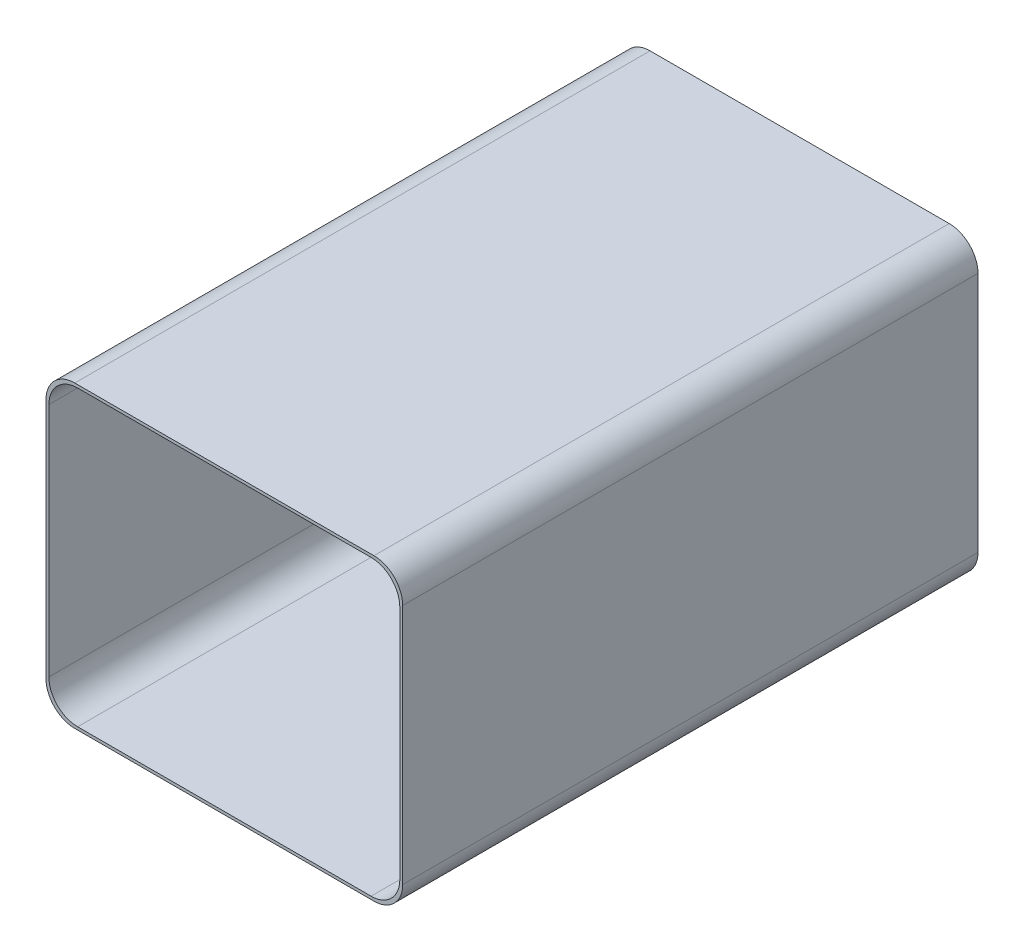
ISO-10303-21;
HEADER;
FILE_DESCRIPTION(('STEP AP214'),'2;1');
FILE_NAME('part.step','',(''),(''),'','','');
FILE_SCHEMA(('AUTOMOTIVE_DESIGN { 1 0 10303 214 1 1 1 1 }'));
ENDSEC;
DATA;
#1=APPLICATION_CONTEXT('core data for automotive mechanical design processes');
#2=APPLICATION_PROTOCOL_DEFINITION('international standard','automotive_design',2000,#1);
#3=PRODUCT_CONTEXT('',#1,'mechanical');
#4=PRODUCT('Part','Part','',(#3));
#5=PRODUCT_RELATED_PRODUCT_CATEGORY('part','',(#4));
#6=PRODUCT_DEFINITION_FORMATION('','',#4);
#7=PRODUCT_DEFINITION_CONTEXT('part definition',#1,'design');
#8=PRODUCT_DEFINITION('design','',#6,#7);
#9=PRODUCT_DEFINITION_SHAPE('','',#8);
#10=(LENGTH_UNIT() NAMED_UNIT(*) SI_UNIT(.MILLI.,.METRE.));
#11=(NAMED_UNIT(*) PLANE_ANGLE_UNIT() SI_UNIT($,.RADIAN.));
#12=(NAMED_UNIT(*) SI_UNIT($,.STERADIAN.) SOLID_ANGLE_UNIT());
#13=UNCERTAINTY_MEASURE_WITH_UNIT(LENGTH_MEASURE(1.E-05),#10,'distance_accuracy_value','');
#14=(GEOMETRIC_REPRESENTATION_CONTEXT(3) GLOBAL_UNCERTAINTY_ASSIGNED_CONTEXT((#13)) GLOBAL_UNIT_ASSIGNED_CONTEXT((#10,
#11,#12)) REPRESENTATION_CONTEXT('',''));
#15=CARTESIAN_POINT('',(0.,0.,0.));
#16=DIRECTION('',(0.,0.,1.));
#17=DIRECTION('',(1.,0.,0.));
#18=AXIS2_PLACEMENT_3D('',#15,#16,#17);
#19=CARTESIAN_POINT('',(540.837944664032,-394.765480895916,1000.));
#20=DIRECTION('',(0.,0.,1.));
#21=DIRECTION('',(1.,0.,0.));
#22=AXIS2_PLACEMENT_3D('',#19,#20,#21);
#23=PLANE('',#22);
#24=CARTESIAN_POINT('',(540.837944664032,-394.765480895916,1000.));
#25=DIRECTION('',(0.,0.,1.));
#26=DIRECTION('',(1.,0.,0.));
#27=AXIS2_PLACEMENT_3D('',#24,#25,#26);
#28=CIRCLE('',#27,50.);
#29=CARTESIAN_POINT('',(540.837944664031,-444.765480895916,1000.));
#30=VERTEX_POINT('',#29);
#31=CARTESIAN_POINT('',(590.837944664032,-394.765480895915,1000.));
#32=VERTEX_POINT('',#31);
#33=EDGE_CURVE('E246',#30,#32,#28,.T.);
#34=ORIENTED_EDGE('',*,*,#33,.T.);
#35=DIRECTION('',(0.,1.,0.));
#36=VECTOR('',#35,1.);
#37=CARTESIAN_POINT('',(590.837944664032,25.234519104084,1000.));
#38=LINE('',#37,#36);
#39=CARTESIAN_POINT('',(590.837944664032,25.234519104084,1000.));
#40=VERTEX_POINT('',#39);
#41=EDGE_CURVE('E250',#32,#40,#38,.T.);
#42=ORIENTED_EDGE('',*,*,#41,.T.);
#43=CARTESIAN_POINT('',(540.837944664032,25.2345191040843,1000.));
#44=DIRECTION('',(0.,0.,1.));
#45=DIRECTION('',(-1.,0.,0.));
#46=AXIS2_PLACEMENT_3D('',#43,#44,#45);
#47=CIRCLE('',#46,50.);
#48=CARTESIAN_POINT('',(540.837944664031,75.2345191040843,1000.));
#49=VERTEX_POINT('',#48);
#50=EDGE_CURVE('E254',#40,#49,#47,.T.);
#51=ORIENTED_EDGE('',*,*,#50,.T.);
#52=DIRECTION('',(-1.,0.,0.));
#53=VECTOR('',#52,1.);
#54=CARTESIAN_POINT('',(20.837944664032,75.2345191040843,1000.));
#55=LINE('',#54,#53);
#56=CARTESIAN_POINT('',(20.837944664032,75.2345191040843,1000.));
#57=VERTEX_POINT('',#56);
#58=EDGE_CURVE('E257',#49,#57,#55,.T.);
#59=ORIENTED_EDGE('',*,*,#58,.T.);
#60=CARTESIAN_POINT('',(20.8379446640316,25.2345191040843,1000.));
#61=DIRECTION('',(0.,0.,1.));
#62=DIRECTION('',(1.,0.,0.));
#63=AXIS2_PLACEMENT_3D('',#60,#61,#62);
#64=CIRCLE('',#63,50.);
#65=CARTESIAN_POINT('',(-29.1620553359684,25.234519104084,1000.));
#66=VERTEX_POINT('',#65);
#67=EDGE_CURVE('E260',#57,#66,#64,.T.);
#68=ORIENTED_EDGE('',*,*,#67,.T.);
#69=DIRECTION('',(0.,-1.,0.));
#70=VECTOR('',#69,1.);
#71=CARTESIAN_POINT('',(-29.1620553359684,25.234519104084,1000.));
#72=LINE('',#71,#70);
#73=CARTESIAN_POINT('',(-29.1620553359683,-394.765480895915,1000.));
#74=VERTEX_POINT('',#73);
#75=EDGE_CURVE('E263',#66,#74,#72,.T.);
#76=ORIENTED_EDGE('',*,*,#75,.T.);
#77=CARTESIAN_POINT('',(20.8379446640317,-394.765480895916,1000.));
#78=DIRECTION('',(0.,0.,1.));
#79=DIRECTION('',(1.,0.,0.));
#80=AXIS2_PLACEMENT_3D('',#77,#78,#79);
#81=CIRCLE('',#80,50.);
#82=CARTESIAN_POINT('',(20.837944664032,-444.765480895916,1000.));
#83=VERTEX_POINT('',#82);
#84=EDGE_CURVE('E266',#74,#83,#81,.T.);
#85=ORIENTED_EDGE('',*,*,#84,.T.);
#86=DIRECTION('',(1.,0.,0.));
#87=VECTOR('',#86,1.);
#88=CARTESIAN_POINT('',(20.837944664032,-444.765480895916,1000.));
#89=LINE('',#88,#87);
#90=EDGE_CURVE('E269',#83,#30,#89,.T.);
#91=ORIENTED_EDGE('',*,*,#90,.T.);
#92=EDGE_LOOP('',(#34,#42,#51,#59,#68,#76,#85,#91));
#93=FACE_BOUND('',#92,.T.);
#94=DIRECTION('',(0.,1.,0.));
#95=VECTOR('',#94,1.);
#96=CARTESIAN_POINT('',(585.837944664032,20.234519104084,1000.));
#97=LINE('',#96,#95);
#98=CARTESIAN_POINT('',(585.837944664032,-389.765480895915,1000.));
#99=VERTEX_POINT('',#98);
#100=CARTESIAN_POINT('',(585.837944664032,20.234519104084,1000.));
#101=VERTEX_POINT('',#100);
#102=EDGE_CURVE('E166',#99,#101,#97,.T.);
#103=ORIENTED_EDGE('',*,*,#102,.F.);
#104=CARTESIAN_POINT('',(535.837944664032,-389.765480895916,1000.));
#105=DIRECTION('',(0.,0.,1.));
#106=DIRECTION('',(1.,0.,0.));
#107=AXIS2_PLACEMENT_3D('',#104,#105,#106);
#108=CIRCLE('',#107,50.);
#109=CARTESIAN_POINT('',(535.837944664031,-439.765480895916,1000.));
#110=VERTEX_POINT('',#109);
#111=EDGE_CURVE('E157',#110,#99,#108,.T.);
#112=ORIENTED_EDGE('',*,*,#111,.F.);
#113=DIRECTION('',(1.,0.,0.));
#114=VECTOR('',#113,1.);
#115=CARTESIAN_POINT('',(25.837944664032,-439.765480895916,1000.));
#116=LINE('',#115,#114);
#117=CARTESIAN_POINT('',(25.8379446640321,-439.765480895916,1000.));
#118=VERTEX_POINT('',#117);
#119=EDGE_CURVE('E198',#118,#110,#116,.T.);
#120=ORIENTED_EDGE('',*,*,#119,.F.);
#121=CARTESIAN_POINT('',(25.8379446640317,-389.765480895916,1000.));
#122=DIRECTION('',(0.,0.,1.));
#123=DIRECTION('',(1.,0.,0.));
#124=AXIS2_PLACEMENT_3D('',#121,#122,#123);
#125=CIRCLE('',#124,50.);
#126=CARTESIAN_POINT('',(-24.1620553359683,-389.765480895915,1000.));
#127=VERTEX_POINT('',#126);
#128=EDGE_CURVE('E195',#127,#118,#125,.T.);
#129=ORIENTED_EDGE('',*,*,#128,.F.);
#130=DIRECTION('',(0.,-1.,0.));
#131=VECTOR('',#130,1.);
#132=CARTESIAN_POINT('',(-24.1620553359684,20.234519104084,1000.));
#133=LINE('',#132,#131);
#134=CARTESIAN_POINT('',(-24.1620553359684,20.234519104084,1000.));
#135=VERTEX_POINT('',#134);
#136=EDGE_CURVE('E192',#135,#127,#133,.T.);
#137=ORIENTED_EDGE('',*,*,#136,.F.);
#138=CARTESIAN_POINT('',(25.8379446640316,20.2345191040843,1000.));
#139=DIRECTION('',(0.,0.,1.));
#140=DIRECTION('',(1.,0.,0.));
#141=AXIS2_PLACEMENT_3D('',#138,#139,#140);
#142=CIRCLE('',#141,50.);
#143=CARTESIAN_POINT('',(25.837944664032,70.2345191040843,1000.));
#144=VERTEX_POINT('',#143);
#145=EDGE_CURVE('E189',#144,#135,#142,.T.);
#146=ORIENTED_EDGE('',*,*,#145,.F.);
#147=DIRECTION('',(-1.,0.,0.));
#148=VECTOR('',#147,1.);
#149=CARTESIAN_POINT('',(25.837944664032,70.2345191040843,1000.));
#150=LINE('',#149,#148);
#151=CARTESIAN_POINT('',(535.837944664031,70.2345191040843,1000.));
#152=VERTEX_POINT('',#151);
#153=EDGE_CURVE('E184',#152,#144,#150,.T.);
#154=ORIENTED_EDGE('',*,*,#153,.F.);
#155=CARTESIAN_POINT('',(535.837944664032,20.2345191040843,1000.));
#156=DIRECTION('',(0.,0.,1.));
#157=DIRECTION('',(-1.,0.,0.));
#158=AXIS2_PLACEMENT_3D('',#155,#156,#157);
#159=CIRCLE('',#158,50.);
#160=EDGE_CURVE('E180',#101,#152,#159,.T.);
#161=ORIENTED_EDGE('',*,*,#160,.F.);
#162=EDGE_LOOP('',(#103,#112,#120,#129,#137,#146,#154,#161));
#163=FACE_BOUND('',#162,.T.);
#164=ADVANCED_FACE('F43',(#93,#163),#23,.T.);
#165=CARTESIAN_POINT('',(540.837944664032,-394.765480895916,0.));
#166=DIRECTION('',(0.,0.,1.));
#167=DIRECTION('',(1.,0.,0.));
#168=AXIS2_PLACEMENT_3D('',#165,#166,#167);
#169=PLANE('',#168);
#170=CARTESIAN_POINT('',(540.837944664032,-394.765480895916,0.));
#171=DIRECTION('',(0.,0.,1.));
#172=DIRECTION('',(1.,0.,0.));
#173=AXIS2_PLACEMENT_3D('',#170,#171,#172);
#174=CIRCLE('',#173,50.);
#175=CARTESIAN_POINT('',(540.837944664031,-444.765480895916,0.));
#176=VERTEX_POINT('',#175);
#177=CARTESIAN_POINT('',(590.837944664032,-394.765480895915,0.));
#178=VERTEX_POINT('',#177);
#179=EDGE_CURVE('E175',#176,#178,#174,.T.);
#180=ORIENTED_EDGE('',*,*,#179,.F.);
#181=DIRECTION('',(1.,0.,0.));
#182=VECTOR('',#181,1.);
#183=CARTESIAN_POINT('',(20.837944664032,-444.765480895916,0.));
#184=LINE('',#183,#182);
#185=CARTESIAN_POINT('',(20.837944664032,-444.765480895916,0.));
#186=VERTEX_POINT('',#185);
#187=EDGE_CURVE('E251',#186,#176,#184,.T.);
#188=ORIENTED_EDGE('',*,*,#187,.F.);
#189=CARTESIAN_POINT('',(20.8379446640317,-394.765480895916,0.));
#190=DIRECTION('',(0.,0.,1.));
#191=DIRECTION('',(1.,0.,0.));
#192=AXIS2_PLACEMENT_3D('',#189,#190,#191);
#193=CIRCLE('',#192,50.);
#194=CARTESIAN_POINT('',(-29.1620553359683,-394.765480895915,0.));
#195=VERTEX_POINT('',#194);
#196=EDGE_CURVE('E291',#195,#186,#193,.T.);
#197=ORIENTED_EDGE('',*,*,#196,.F.);
#198=DIRECTION('',(0.,-1.,0.));
#199=VECTOR('',#198,1.);
#200=CARTESIAN_POINT('',(-29.1620553359684,25.234519104084,0.));
#201=LINE('',#200,#199);
#202=CARTESIAN_POINT('',(-29.1620553359684,25.234519104084,0.));
#203=VERTEX_POINT('',#202);
#204=EDGE_CURVE('E288',#203,#195,#201,.T.);
#205=ORIENTED_EDGE('',*,*,#204,.F.);
#206=CARTESIAN_POINT('',(20.8379446640316,25.2345191040843,0.));
#207=DIRECTION('',(0.,0.,1.));
#208=DIRECTION('',(1.,0.,0.));
#209=AXIS2_PLACEMENT_3D('',#206,#207,#208);
#210=CIRCLE('',#209,50.);
#211=CARTESIAN_POINT('',(20.837944664032,75.2345191040843,0.));
#212=VERTEX_POINT('',#211);
#213=EDGE_CURVE('E285',#212,#203,#210,.T.);
#214=ORIENTED_EDGE('',*,*,#213,.F.);
#215=DIRECTION('',(-1.,0.,0.));
#216=VECTOR('',#215,1.);
#217=CARTESIAN_POINT('',(20.837944664032,75.2345191040843,0.));
#218=LINE('',#217,#216);
#219=CARTESIAN_POINT('',(540.837944664031,75.2345191040843,0.));
#220=VERTEX_POINT('',#219);
#221=EDGE_CURVE('E282',#220,#212,#218,.T.);
#222=ORIENTED_EDGE('',*,*,#221,.F.);
#223=CARTESIAN_POINT('',(540.837944664032,25.2345191040843,0.));
#224=DIRECTION('',(0.,0.,1.));
#225=DIRECTION('',(-1.,0.,0.));
#226=AXIS2_PLACEMENT_3D('',#223,#224,#225);
#227=CIRCLE('',#226,50.);
#228=CARTESIAN_POINT('',(590.837944664032,25.234519104084,0.));
#229=VERTEX_POINT('',#228);
#230=EDGE_CURVE('E279',#229,#220,#227,.T.);
#231=ORIENTED_EDGE('',*,*,#230,.F.);
#232=DIRECTION('',(0.,1.,0.));
#233=VECTOR('',#232,1.);
#234=CARTESIAN_POINT('',(590.837944664032,25.234519104084,0.));
#235=LINE('',#234,#233);
#236=EDGE_CURVE('E276',#178,#229,#235,.T.);
#237=ORIENTED_EDGE('',*,*,#236,.F.);
#238=EDGE_LOOP('',(#180,#188,#197,#205,#214,#222,#231,#237));
#239=FACE_BOUND('',#238,.T.);
#240=CARTESIAN_POINT('',(535.837944664032,-389.765480895916,0.));
#241=DIRECTION('',(0.,0.,1.));
#242=DIRECTION('',(1.,0.,0.));
#243=AXIS2_PLACEMENT_3D('',#240,#241,#242);
#244=CIRCLE('',#243,50.);
#245=CARTESIAN_POINT('',(535.837944664031,-439.765480895916,0.));
#246=VERTEX_POINT('',#245);
#247=CARTESIAN_POINT('',(585.837944664032,-389.765480895915,0.));
#248=VERTEX_POINT('',#247);
#249=EDGE_CURVE('E67',#246,#248,#244,.T.);
#250=ORIENTED_EDGE('',*,*,#249,.T.);
#251=DIRECTION('',(0.,1.,0.));
#252=VECTOR('',#251,1.);
#253=CARTESIAN_POINT('',(585.837944664032,20.234519104084,0.));
#254=LINE('',#253,#252);
#255=CARTESIAN_POINT('',(585.837944664032,20.234519104084,0.));
#256=VERTEX_POINT('',#255);
#257=EDGE_CURVE('E173',#248,#256,#254,.T.);
#258=ORIENTED_EDGE('',*,*,#257,.T.);
#259=CARTESIAN_POINT('',(535.837944664032,20.2345191040843,0.));
#260=DIRECTION('',(0.,0.,1.));
#261=DIRECTION('',(-1.,0.,0.));
#262=AXIS2_PLACEMENT_3D('',#259,#260,#261);
#263=CIRCLE('',#262,50.);
#264=CARTESIAN_POINT('',(535.837944664031,70.2345191040843,0.));
#265=VERTEX_POINT('',#264);
#266=EDGE_CURVE('E205',#256,#265,#263,.T.);
#267=ORIENTED_EDGE('',*,*,#266,.T.);
#268=DIRECTION('',(-1.,0.,0.));
#269=VECTOR('',#268,1.);
#270=CARTESIAN_POINT('',(25.837944664032,70.2345191040843,0.));
#271=LINE('',#270,#269);
#272=CARTESIAN_POINT('',(25.837944664032,70.2345191040843,0.));
#273=VERTEX_POINT('',#272);
#274=EDGE_CURVE('E209',#265,#273,#271,.T.);
#275=ORIENTED_EDGE('',*,*,#274,.T.);
#276=CARTESIAN_POINT('',(25.8379446640316,20.2345191040843,0.));
#277=DIRECTION('',(0.,0.,1.));
#278=DIRECTION('',(1.,0.,0.));
#279=AXIS2_PLACEMENT_3D('',#276,#277,#278);
#280=CIRCLE('',#279,50.);
#281=CARTESIAN_POINT('',(-24.1620553359684,20.234519104084,0.));
#282=VERTEX_POINT('',#281);
#283=EDGE_CURVE('E213',#273,#282,#280,.T.);
#284=ORIENTED_EDGE('',*,*,#283,.T.);
#285=DIRECTION('',(0.,-1.,0.));
#286=VECTOR('',#285,1.);
#287=CARTESIAN_POINT('',(-24.1620553359684,20.234519104084,0.));
#288=LINE('',#287,#286);
#289=CARTESIAN_POINT('',(-24.1620553359683,-389.765480895915,0.));
#290=VERTEX_POINT('',#289);
#291=EDGE_CURVE('E217',#282,#290,#288,.T.);
#292=ORIENTED_EDGE('',*,*,#291,.T.);
#293=CARTESIAN_POINT('',(25.8379446640317,-389.765480895916,0.));
#294=DIRECTION('',(0.,0.,1.));
#295=DIRECTION('',(1.,0.,0.));
#296=AXIS2_PLACEMENT_3D('',#293,#294,#295);
#297=CIRCLE('',#296,50.);
#298=CARTESIAN_POINT('',(25.837944664032,-439.765480895916,0.));
#299=VERTEX_POINT('',#298);
#300=EDGE_CURVE('E221',#290,#299,#297,.T.);
#301=ORIENTED_EDGE('',*,*,#300,.T.);
#302=DIRECTION('',(1.,0.,0.));
#303=VECTOR('',#302,1.);
#304=CARTESIAN_POINT('',(25.837944664032,-439.765480895916,0.));
#305=LINE('',#304,#303);
#306=EDGE_CURVE('E167',#299,#246,#305,.T.);
#307=ORIENTED_EDGE('',*,*,#306,.T.);
#308=EDGE_LOOP('',(#250,#258,#267,#275,#284,#292,#301,#307));
#309=FACE_BOUND('',#308,.T.);
#310=ADVANCED_FACE('F330',(#239,#309),#169,.F.);
#311=CARTESIAN_POINT('',(540.837944664032,-394.765480895916,1000.));
#312=DIRECTION('',(0.,0.,-1.));
#313=DIRECTION('',(-1.,0.,0.));
#314=AXIS2_PLACEMENT_3D('',#311,#312,#313);
#315=CYLINDRICAL_SURFACE('',#314,50.);
#316=ORIENTED_EDGE('',*,*,#179,.T.);
#317=DIRECTION('',(0.,0.,-1.));
#318=VECTOR('',#317,1.);
#319=CARTESIAN_POINT('',(590.837944664032,-394.765480895915,1000.));
#320=LINE('',#319,#318);
#321=EDGE_CURVE('E11',#32,#178,#320,.T.);
#322=ORIENTED_EDGE('',*,*,#321,.F.);
#323=ORIENTED_EDGE('',*,*,#33,.F.);
#324=DIRECTION('',(0.,0.,-1.));
#325=VECTOR('',#324,1.);
#326=CARTESIAN_POINT('',(540.837944664031,-444.765480895916,1000.));
#327=LINE('',#326,#325);
#328=EDGE_CURVE('E272',#30,#176,#327,.T.);
#329=ORIENTED_EDGE('',*,*,#328,.T.);
#330=EDGE_LOOP('',(#316,#322,#323,#329));
#331=FACE_BOUND('',#330,.T.);
#332=ADVANCED_FACE('F45',(#331),#315,.T.);
#333=CARTESIAN_POINT('',(590.837944664032,25.234519104084,1000.));
#334=DIRECTION('',(-1.,0.,0.));
#335=DIRECTION('',(0.,-1.,0.));
#336=AXIS2_PLACEMENT_3D('',#333,#334,#335);
#337=PLANE('',#336);
#338=ORIENTED_EDGE('',*,*,#236,.T.);
#339=DIRECTION('',(0.,0.,-1.));
#340=VECTOR('',#339,1.);
#341=CARTESIAN_POINT('',(590.837944664032,25.234519104084,1000.));
#342=LINE('',#341,#340);
#343=EDGE_CURVE('E52',#40,#229,#342,.T.);
#344=ORIENTED_EDGE('',*,*,#343,.F.);
#345=ORIENTED_EDGE('',*,*,#41,.F.);
#346=ORIENTED_EDGE('',*,*,#321,.T.);
#347=EDGE_LOOP('',(#338,#344,#345,#346));
#348=FACE_BOUND('',#347,.T.);
#349=ADVANCED_FACE('F347',(#348),#337,.F.);
#350=CARTESIAN_POINT('',(540.837944664032,25.2345191040843,1000.));
#351=DIRECTION('',(0.,0.,-1.));
#352=DIRECTION('',(-1.,0.,0.));
#353=AXIS2_PLACEMENT_3D('',#350,#351,#352);
#354=CYLINDRICAL_SURFACE('',#353,50.);
#355=ORIENTED_EDGE('',*,*,#230,.T.);
#356=DIRECTION('',(0.,0.,-1.));
#357=VECTOR('',#356,1.);
#358=CARTESIAN_POINT('',(540.837944664031,75.2345191040843,1000.));
#359=LINE('',#358,#357);
#360=EDGE_CURVE('E315',#49,#220,#359,.T.);
#361=ORIENTED_EDGE('',*,*,#360,.F.);
#362=ORIENTED_EDGE('',*,*,#50,.F.);
#363=ORIENTED_EDGE('',*,*,#343,.T.);
#364=EDGE_LOOP('',(#355,#361,#362,#363));
#365=FACE_BOUND('',#364,.T.);
#366=ADVANCED_FACE('F324',(#365),#354,.T.);
#367=CARTESIAN_POINT('',(20.837944664032,75.2345191040843,1000.));
#368=DIRECTION('',(0.,-1.,0.));
#369=DIRECTION('',(0.,0.,-1.));
#370=AXIS2_PLACEMENT_3D('',#367,#368,#369);
#371=PLANE('',#370);
#372=ORIENTED_EDGE('',*,*,#221,.T.);
#373=DIRECTION('',(0.,0.,-1.));
#374=VECTOR('',#373,1.);
#375=CARTESIAN_POINT('',(20.837944664032,75.2345191040843,1000.));
#376=LINE('',#375,#374);
#377=EDGE_CURVE('E311',#57,#212,#376,.T.);
#378=ORIENTED_EDGE('',*,*,#377,.F.);
#379=ORIENTED_EDGE('',*,*,#58,.F.);
#380=ORIENTED_EDGE('',*,*,#360,.T.);
#381=EDGE_LOOP('',(#372,#378,#379,#380));
#382=FACE_BOUND('',#381,.T.);
#383=ADVANCED_FACE('F336',(#382),#371,.F.);
#384=CARTESIAN_POINT('',(20.8379446640316,25.2345191040843,1000.));
#385=DIRECTION('',(0.,0.,-1.));
#386=DIRECTION('',(-1.,0.,0.));
#387=AXIS2_PLACEMENT_3D('',#384,#385,#386);
#388=CYLINDRICAL_SURFACE('',#387,50.);
#389=ORIENTED_EDGE('',*,*,#213,.T.);
#390=DIRECTION('',(0.,0.,-1.));
#391=VECTOR('',#390,1.);
#392=CARTESIAN_POINT('',(-29.1620553359684,25.234519104084,1000.));
#393=LINE('',#392,#391);
#394=EDGE_CURVE('E307',#66,#203,#393,.T.);
#395=ORIENTED_EDGE('',*,*,#394,.F.);
#396=ORIENTED_EDGE('',*,*,#67,.F.);
#397=ORIENTED_EDGE('',*,*,#377,.T.);
#398=EDGE_LOOP('',(#389,#395,#396,#397));
#399=FACE_BOUND('',#398,.T.);
#400=ADVANCED_FACE('F340',(#399),#388,.T.);
#401=CARTESIAN_POINT('',(-29.1620553359684,25.234519104084,1000.));
#402=DIRECTION('',(1.,0.,0.));
#403=DIRECTION('',(0.,1.,0.));
#404=AXIS2_PLACEMENT_3D('',#401,#402,#403);
#405=PLANE('',#404);
#406=ORIENTED_EDGE('',*,*,#204,.T.);
#407=DIRECTION('',(0.,0.,-1.));
#408=VECTOR('',#407,1.);
#409=CARTESIAN_POINT('',(-29.1620553359683,-394.765480895915,1000.));
#410=LINE('',#409,#408);
#411=EDGE_CURVE('E303',#74,#195,#410,.T.);
#412=ORIENTED_EDGE('',*,*,#411,.F.);
#413=ORIENTED_EDGE('',*,*,#75,.F.);
#414=ORIENTED_EDGE('',*,*,#394,.T.);
#415=EDGE_LOOP('',(#406,#412,#413,#414));
#416=FACE_BOUND('',#415,.T.);
#417=ADVANCED_FACE('F360',(#416),#405,.F.);
#418=CARTESIAN_POINT('',(20.8379446640317,-394.765480895916,1000.));
#419=DIRECTION('',(0.,0.,-1.));
#420=DIRECTION('',(-1.,0.,0.));
#421=AXIS2_PLACEMENT_3D('',#418,#419,#420);
#422=CYLINDRICAL_SURFACE('',#421,50.);
#423=ORIENTED_EDGE('',*,*,#196,.T.);
#424=DIRECTION('',(0.,0.,-1.));
#425=VECTOR('',#424,1.);
#426=CARTESIAN_POINT('',(20.837944664032,-444.765480895916,1000.));
#427=LINE('',#426,#425);
#428=EDGE_CURVE('E299',#83,#186,#427,.T.);
#429=ORIENTED_EDGE('',*,*,#428,.F.);
#430=ORIENTED_EDGE('',*,*,#84,.F.);
#431=ORIENTED_EDGE('',*,*,#411,.T.);
#432=EDGE_LOOP('',(#423,#429,#430,#431));
#433=FACE_BOUND('',#432,.T.);
#434=ADVANCED_FACE('F358',(#433),#422,.T.);
#435=CARTESIAN_POINT('',(20.837944664032,-444.765480895916,1000.));
#436=DIRECTION('',(0.,1.,0.));
#437=DIRECTION('',(0.,0.,1.));
#438=AXIS2_PLACEMENT_3D('',#435,#436,#437);
#439=PLANE('',#438);
#440=ORIENTED_EDGE('',*,*,#187,.T.);
#441=ORIENTED_EDGE('',*,*,#328,.F.);
#442=ORIENTED_EDGE('',*,*,#90,.F.);
#443=ORIENTED_EDGE('',*,*,#428,.T.);
#444=EDGE_LOOP('',(#440,#441,#442,#443));
#445=FACE_BOUND('',#444,.T.);
#446=ADVANCED_FACE('F353',(#445),#439,.F.);
#447=CARTESIAN_POINT('',(535.837944664032,-389.765480895916,1000.));
#448=DIRECTION('',(0.,0.,-1.));
#449=DIRECTION('',(-1.,0.,0.));
#450=AXIS2_PLACEMENT_3D('',#447,#448,#449);
#451=CYLINDRICAL_SURFACE('',#450,50.);
#452=ORIENTED_EDGE('',*,*,#249,.F.);
#453=DIRECTION('',(0.,0.,-1.));
#454=VECTOR('',#453,1.);
#455=CARTESIAN_POINT('',(535.837944664031,-439.765480895916,1000.));
#456=LINE('',#455,#454);
#457=EDGE_CURVE('E161',#110,#246,#456,.T.);
#458=ORIENTED_EDGE('',*,*,#457,.F.);
#459=ORIENTED_EDGE('',*,*,#111,.T.);
#460=DIRECTION('',(0.,0.,-1.));
#461=VECTOR('',#460,1.);
#462=CARTESIAN_POINT('',(585.837944664032,-389.765480895915,1000.));
#463=LINE('',#462,#461);
#464=EDGE_CURVE('E160',#99,#248,#463,.T.);
#465=ORIENTED_EDGE('',*,*,#464,.T.);
#466=EDGE_LOOP('',(#452,#458,#459,#465));
#467=FACE_BOUND('',#466,.T.);
#468=ADVANCED_FACE('F159',(#467),#451,.F.);
#469=CARTESIAN_POINT('',(585.837944664032,20.234519104084,1000.));
#470=DIRECTION('',(-1.,0.,0.));
#471=DIRECTION('',(0.,-1.,0.));
#472=AXIS2_PLACEMENT_3D('',#469,#470,#471);
#473=PLANE('',#472);
#474=ORIENTED_EDGE('',*,*,#257,.F.);
#475=ORIENTED_EDGE('',*,*,#464,.F.);
#476=ORIENTED_EDGE('',*,*,#102,.T.);
#477=DIRECTION('',(0.,0.,-1.));
#478=VECTOR('',#477,1.);
#479=CARTESIAN_POINT('',(585.837944664032,20.234519104084,1000.));
#480=LINE('',#479,#478);
#481=EDGE_CURVE('E176',#101,#256,#480,.T.);
#482=ORIENTED_EDGE('',*,*,#481,.T.);
#483=EDGE_LOOP('',(#474,#475,#476,#482));
#484=FACE_BOUND('',#483,.T.);
#485=ADVANCED_FACE('F170',(#484),#473,.T.);
#486=CARTESIAN_POINT('',(535.837944664032,20.2345191040843,1000.));
#487=DIRECTION('',(0.,0.,-1.));
#488=DIRECTION('',(-1.,0.,0.));
#489=AXIS2_PLACEMENT_3D('',#486,#487,#488);
#490=CYLINDRICAL_SURFACE('',#489,50.);
#491=ORIENTED_EDGE('',*,*,#266,.F.);
#492=ORIENTED_EDGE('',*,*,#481,.F.);
#493=ORIENTED_EDGE('',*,*,#160,.T.);
#494=DIRECTION('',(0.,0.,-1.));
#495=VECTOR('',#494,1.);
#496=CARTESIAN_POINT('',(535.837944664031,70.2345191040843,1000.));
#497=LINE('',#496,#495);
#498=EDGE_CURVE('E241',#152,#265,#497,.T.);
#499=ORIENTED_EDGE('',*,*,#498,.T.);
#500=EDGE_LOOP('',(#491,#492,#493,#499));
#501=FACE_BOUND('',#500,.T.);
#502=ADVANCED_FACE('F385',(#501),#490,.F.);
#503=CARTESIAN_POINT('',(25.837944664032,70.2345191040843,1000.));
#504=DIRECTION('',(0.,-1.,0.));
#505=DIRECTION('',(0.,0.,-1.));
#506=AXIS2_PLACEMENT_3D('',#503,#504,#505);
#507=PLANE('',#506);
#508=ORIENTED_EDGE('',*,*,#274,.F.);
#509=ORIENTED_EDGE('',*,*,#498,.F.);
#510=ORIENTED_EDGE('',*,*,#153,.T.);
#511=DIRECTION('',(0.,0.,-1.));
#512=VECTOR('',#511,1.);
#513=CARTESIAN_POINT('',(25.837944664032,70.2345191040843,1000.));
#514=LINE('',#513,#512);
#515=EDGE_CURVE('E238',#144,#273,#514,.T.);
#516=ORIENTED_EDGE('',*,*,#515,.T.);
#517=EDGE_LOOP('',(#508,#509,#510,#516));
#518=FACE_BOUND('',#517,.T.);
#519=ADVANCED_FACE('F389',(#518),#507,.T.);
#520=CARTESIAN_POINT('',(25.8379446640316,20.2345191040843,1000.));
#521=DIRECTION('',(0.,0.,-1.));
#522=DIRECTION('',(-1.,0.,0.));
#523=AXIS2_PLACEMENT_3D('',#520,#521,#522);
#524=CYLINDRICAL_SURFACE('',#523,50.);
#525=ORIENTED_EDGE('',*,*,#283,.F.);
#526=ORIENTED_EDGE('',*,*,#515,.F.);
#527=ORIENTED_EDGE('',*,*,#145,.T.);
#528=DIRECTION('',(0.,0.,-1.));
#529=VECTOR('',#528,1.);
#530=CARTESIAN_POINT('',(-24.1620553359684,20.234519104084,1000.));
#531=LINE('',#530,#529);
#532=EDGE_CURVE('E235',#135,#282,#531,.T.);
#533=ORIENTED_EDGE('',*,*,#532,.T.);
#534=EDGE_LOOP('',(#525,#526,#527,#533));
#535=FACE_BOUND('',#534,.T.);
#536=ADVANCED_FACE('F395',(#535),#524,.F.);
#537=CARTESIAN_POINT('',(-24.1620553359684,20.234519104084,1000.));
#538=DIRECTION('',(1.,0.,0.));
#539=DIRECTION('',(0.,1.,0.));
#540=AXIS2_PLACEMENT_3D('',#537,#538,#539);
#541=PLANE('',#540);
#542=ORIENTED_EDGE('',*,*,#291,.F.);
#543=ORIENTED_EDGE('',*,*,#532,.F.);
#544=ORIENTED_EDGE('',*,*,#136,.T.);
#545=DIRECTION('',(0.,0.,-1.));
#546=VECTOR('',#545,1.);
#547=CARTESIAN_POINT('',(-24.1620553359683,-389.765480895915,1000.));
#548=LINE('',#547,#546);
#549=EDGE_CURVE('E232',#127,#290,#548,.T.);
#550=ORIENTED_EDGE('',*,*,#549,.T.);
#551=EDGE_LOOP('',(#542,#543,#544,#550));
#552=FACE_BOUND('',#551,.T.);
#553=ADVANCED_FACE('F399',(#552),#541,.T.);
#554=CARTESIAN_POINT('',(25.8379446640317,-389.765480895916,1000.));
#555=DIRECTION('',(0.,0.,-1.));
#556=DIRECTION('',(-1.,0.,0.));
#557=AXIS2_PLACEMENT_3D('',#554,#555,#556);
#558=CYLINDRICAL_SURFACE('',#557,50.);
#559=ORIENTED_EDGE('',*,*,#300,.F.);
#560=ORIENTED_EDGE('',*,*,#549,.F.);
#561=ORIENTED_EDGE('',*,*,#128,.T.);
#562=DIRECTION('',(0.,0.,-1.));
#563=VECTOR('',#562,1.);
#564=CARTESIAN_POINT('',(25.837944664032,-439.765480895916,1000.));
#565=LINE('',#564,#563);
#566=EDGE_CURVE('E59',#118,#299,#565,.T.);
#567=ORIENTED_EDGE('',*,*,#566,.T.);
#568=EDGE_LOOP('',(#559,#560,#561,#567));
#569=FACE_BOUND('',#568,.T.);
#570=ADVANCED_FACE('F403',(#569),#558,.F.);
#571=CARTESIAN_POINT('',(25.837944664032,-439.765480895916,1000.));
#572=DIRECTION('',(0.,1.,0.));
#573=DIRECTION('',(0.,0.,1.));
#574=AXIS2_PLACEMENT_3D('',#571,#572,#573);
#575=PLANE('',#574);
#576=ORIENTED_EDGE('',*,*,#306,.F.);
#577=ORIENTED_EDGE('',*,*,#566,.F.);
#578=ORIENTED_EDGE('',*,*,#119,.T.);
#579=ORIENTED_EDGE('',*,*,#457,.T.);
#580=EDGE_LOOP('',(#576,#577,#578,#579));
#581=FACE_BOUND('',#580,.T.);
#582=ADVANCED_FACE('F407',(#581),#575,.T.);
#583=CLOSED_SHELL('',(#164,#310,#332,#349,#366,#383,#400,#417,#434,#446,#468,#485,#502,#519,
#536,#553,#570,#582));
#584=MANIFOLD_SOLID_BREP('B2',#583);
#585=ADVANCED_BREP_SHAPE_REPRESENTATION('',(#18,#584),#14);
#586=SHAPE_DEFINITION_REPRESENTATION(#9,#585);
ENDSEC;
END-ISO-10303-21;
